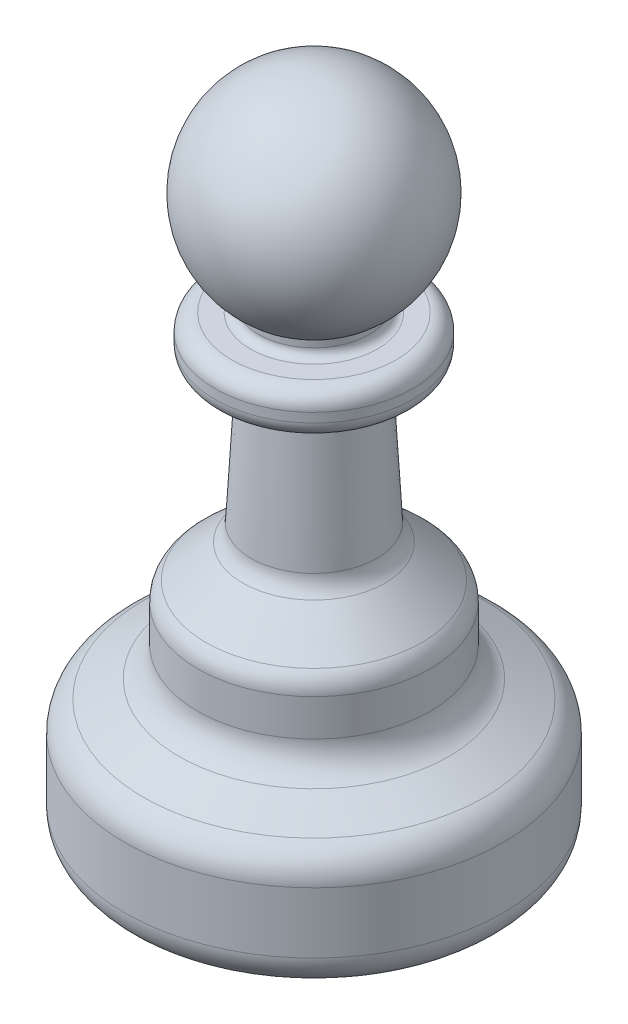
ISO-10303-21;
HEADER;
FILE_DESCRIPTION(('STEP AP214'),'2;1');
FILE_NAME('part.step','',(''),(''),'','','');
FILE_SCHEMA(('AUTOMOTIVE_DESIGN { 1 0 10303 214 1 1 1 1 }'));
ENDSEC;
DATA;
#1=APPLICATION_CONTEXT('core data for automotive mechanical design processes');
#2=APPLICATION_PROTOCOL_DEFINITION('international standard','automotive_design',2000,#1);
#3=PRODUCT_CONTEXT('',#1,'mechanical');
#4=PRODUCT('Part','Part','',(#3));
#5=PRODUCT_RELATED_PRODUCT_CATEGORY('part','',(#4));
#6=PRODUCT_DEFINITION_FORMATION('','',#4);
#7=PRODUCT_DEFINITION_CONTEXT('part definition',#1,'design');
#8=PRODUCT_DEFINITION('design','',#6,#7);
#9=PRODUCT_DEFINITION_SHAPE('','',#8);
#10=(LENGTH_UNIT() NAMED_UNIT(*) SI_UNIT(.MILLI.,.METRE.));
#11=(NAMED_UNIT(*) PLANE_ANGLE_UNIT() SI_UNIT($,.RADIAN.));
#12=(NAMED_UNIT(*) SI_UNIT($,.STERADIAN.) SOLID_ANGLE_UNIT());
#13=UNCERTAINTY_MEASURE_WITH_UNIT(LENGTH_MEASURE(1.E-05),#10,'distance_accuracy_value','');
#14=(GEOMETRIC_REPRESENTATION_CONTEXT(3) GLOBAL_UNCERTAINTY_ASSIGNED_CONTEXT((#13)) GLOBAL_UNIT_ASSIGNED_CONTEXT((#10,
#11,#12)) REPRESENTATION_CONTEXT('',''));
#15=CARTESIAN_POINT('',(0.,0.,0.));
#16=DIRECTION('',(0.,0.,1.));
#17=DIRECTION('',(1.,0.,0.));
#18=AXIS2_PLACEMENT_3D('',#15,#16,#17);
#19=CARTESIAN_POINT('',(25.4657033401047,67.5,0.));
#20=DIRECTION('',(0.,-1.,0.));
#21=DIRECTION('',(1.,0.,0.));
#22=AXIS2_PLACEMENT_3D('',#19,#20,#21);
#23=SPHERICAL_SURFACE('',#22,12.5);
#24=CARTESIAN_POINT('',(25.4657033401048,56.8990852902304,0.));
#25=DIRECTION('',(0.,-1.,0.));
#26=DIRECTION('',(1.,0.,0.));
#27=AXIS2_PLACEMENT_3D('',#24,#25,#26);
#28=CIRCLE('',#27,6.62348905911311);
#29=CARTESIAN_POINT('',(32.0891923992179,56.8990852902304,0.));
#30=VERTEX_POINT('',#29);
#31=EDGE_CURVE('E10',#30,#30,#28,.T.);
#32=ORIENTED_EDGE('',*,*,#31,.F.);
#33=EDGE_LOOP('',(#32));
#34=FACE_BOUND('',#33,.T.);
#35=ADVANCED_FACE('F35',(#34),#23,.T.);
#36=CARTESIAN_POINT('',(25.4657033401048,0.,0.));
#37=DIRECTION('',(0.,-1.,0.));
#38=DIRECTION('',(1.,0.,0.));
#39=AXIS2_PLACEMENT_3D('',#36,#37,#38);
#40=CYLINDRICAL_SURFACE('',#39,6.62348905911311);
#41=CARTESIAN_POINT('',(25.4657033401048,56.0860915544175,0.));
#42=DIRECTION('',(0.,-1.,0.));
#43=DIRECTION('',(1.,0.,0.));
#44=AXIS2_PLACEMENT_3D('',#41,#42,#43);
#45=CIRCLE('',#44,6.62348905911311);
#46=CARTESIAN_POINT('',(32.0891923992179,56.0860915544175,0.));
#47=VERTEX_POINT('',#46);
#48=EDGE_CURVE('E41',#47,#47,#45,.T.);
#49=ORIENTED_EDGE('',*,*,#48,.F.);
#50=EDGE_LOOP('',(#49));
#51=FACE_BOUND('',#50,.T.);
#52=ORIENTED_EDGE('',*,*,#31,.T.);
#53=EDGE_LOOP('',(#52));
#54=FACE_BOUND('',#53,.T.);
#55=ADVANCED_FACE('F200',(#51,#54),#40,.T.);
#56=CARTESIAN_POINT('',(25.4657033401047,56.0860915544175,0.));
#57=DIRECTION('',(0.,-1.,0.));
#58=DIRECTION('',(1.,0.,0.));
#59=AXIS2_PLACEMENT_3D('',#56,#57,#58);
#60=TOROIDAL_SURFACE('',#59,7.62348905911311,1.);
#61=CARTESIAN_POINT('',(25.4657033401048,55.0860915544175,0.));
#62=DIRECTION('',(0.,-1.,0.));
#63=DIRECTION('',(1.,0.,0.));
#64=AXIS2_PLACEMENT_3D('',#61,#62,#63);
#65=CIRCLE('',#64,7.62348905911312);
#66=CARTESIAN_POINT('',(33.0891923992179,55.0860915544175,0.));
#67=VERTEX_POINT('',#66);
#68=EDGE_CURVE('E45',#67,#67,#65,.T.);
#69=ORIENTED_EDGE('',*,*,#68,.F.);
#70=EDGE_LOOP('',(#69));
#71=FACE_BOUND('',#70,.T.);
#72=ORIENTED_EDGE('',*,*,#48,.T.);
#73=EDGE_LOOP('',(#72));
#74=FACE_BOUND('',#73,.T.);
#75=ADVANCED_FACE('F195',(#71,#74),#60,.F.);
#76=CARTESIAN_POINT('',(15.5900832441826,55.0860915544175,0.));
#77=DIRECTION('',(0.,-1.,0.));
#78=DIRECTION('',(1.,0.,0.));
#79=AXIS2_PLACEMENT_3D('',#76,#77,#78);
#80=PLANE('',#79);
#81=CARTESIAN_POINT('',(25.4657033401048,55.0860915544175,0.));
#82=DIRECTION('',(0.,-1.,0.));
#83=DIRECTION('',(1.,0.,0.));
#84=AXIS2_PLACEMENT_3D('',#81,#82,#83);
#85=CIRCLE('',#84,9.87562009592211);
#86=CARTESIAN_POINT('',(35.3413234360269,55.0860915544175,0.));
#87=VERTEX_POINT('',#86);
#88=EDGE_CURVE('E49',#87,#87,#85,.T.);
#89=ORIENTED_EDGE('',*,*,#88,.F.);
#90=EDGE_LOOP('',(#89));
#91=FACE_BOUND('',#90,.T.);
#92=ORIENTED_EDGE('',*,*,#68,.T.);
#93=EDGE_LOOP('',(#92));
#94=FACE_BOUND('',#93,.T.);
#95=ADVANCED_FACE('F189',(#91,#94),#80,.F.);
#96=CARTESIAN_POINT('',(25.4657033401047,53.0860915544175,0.));
#97=DIRECTION('',(0.,-1.,0.));
#98=DIRECTION('',(1.,0.,0.));
#99=AXIS2_PLACEMENT_3D('',#96,#97,#98);
#100=TOROIDAL_SURFACE('',#99,9.87562009592212,2.);
#101=CARTESIAN_POINT('',(25.4657033401048,53.0860915544175,0.));
#102=DIRECTION('',(0.,-1.,0.));
#103=DIRECTION('',(1.,0.,0.));
#104=AXIS2_PLACEMENT_3D('',#101,#102,#103);
#105=CIRCLE('',#104,11.8756200959221);
#106=CARTESIAN_POINT('',(37.3413234360269,53.0860915544175,0.));
#107=VERTEX_POINT('',#106);
#108=EDGE_CURVE('E54',#107,#107,#105,.T.);
#109=ORIENTED_EDGE('',*,*,#108,.F.);
#110=EDGE_LOOP('',(#109));
#111=FACE_BOUND('',#110,.T.);
#112=ORIENTED_EDGE('',*,*,#88,.T.);
#113=EDGE_LOOP('',(#112));
#114=FACE_BOUND('',#113,.T.);
#115=ADVANCED_FACE('F183',(#111,#114),#100,.T.);
#116=CARTESIAN_POINT('',(25.4657033401048,0.,0.));
#117=DIRECTION('',(0.,-1.,0.));
#118=DIRECTION('',(1.,0.,0.));
#119=AXIS2_PLACEMENT_3D('',#116,#117,#118);
#120=CYLINDRICAL_SURFACE('',#119,11.8756200959221);
#121=CARTESIAN_POINT('',(25.4657033401048,51.9724533042007,0.));
#122=DIRECTION('',(0.,-1.,0.));
#123=DIRECTION('',(1.,0.,0.));
#124=AXIS2_PLACEMENT_3D('',#121,#122,#123);
#125=CIRCLE('',#124,11.8756200959221);
#126=CARTESIAN_POINT('',(37.3413234360269,51.9724533042007,0.));
#127=VERTEX_POINT('',#126);
#128=EDGE_CURVE('E57',#127,#127,#125,.T.);
#129=ORIENTED_EDGE('',*,*,#128,.F.);
#130=EDGE_LOOP('',(#129));
#131=FACE_BOUND('',#130,.T.);
#132=ORIENTED_EDGE('',*,*,#108,.T.);
#133=EDGE_LOOP('',(#132));
#134=FACE_BOUND('',#133,.T.);
#135=ADVANCED_FACE('F177',(#131,#134),#120,.T.);
#136=CARTESIAN_POINT('',(25.4657033401047,51.9724533042007,0.));
#137=DIRECTION('',(0.,-1.,0.));
#138=DIRECTION('',(1.,0.,0.));
#139=AXIS2_PLACEMENT_3D('',#136,#137,#138);
#140=TOROIDAL_SURFACE('',#139,9.87562009592212,2.);
#141=CARTESIAN_POINT('',(25.4657033401048,49.9724533042007,0.));
#142=DIRECTION('',(0.,-1.,0.));
#143=DIRECTION('',(1.,0.,0.));
#144=AXIS2_PLACEMENT_3D('',#141,#142,#143);
#145=CIRCLE('',#144,9.87562009592211);
#146=CARTESIAN_POINT('',(35.3413234360269,49.9724533042007,0.));
#147=VERTEX_POINT('',#146);
#148=EDGE_CURVE('E60',#147,#147,#145,.T.);
#149=ORIENTED_EDGE('',*,*,#148,.F.);
#150=EDGE_LOOP('',(#149));
#151=FACE_BOUND('',#150,.T.);
#152=ORIENTED_EDGE('',*,*,#128,.T.);
#153=EDGE_LOOP('',(#152));
#154=FACE_BOUND('',#153,.T.);
#155=ADVANCED_FACE('F171',(#151,#154),#140,.T.);
#156=CARTESIAN_POINT('',(17.7860875273158,49.9724533042007,0.));
#157=DIRECTION('',(0.,1.,0.));
#158=DIRECTION('',(-1.,0.,0.));
#159=AXIS2_PLACEMENT_3D('',#156,#157,#158);
#160=PLANE('',#159);
#161=CARTESIAN_POINT('',(25.4657033401048,49.9724533042007,0.));
#162=DIRECTION('',(0.,-1.,0.));
#163=DIRECTION('',(1.,0.,0.));
#164=AXIS2_PLACEMENT_3D('',#161,#162,#163);
#165=CIRCLE('',#164,7.67961581278896);
#166=CARTESIAN_POINT('',(33.1453191528937,49.9724533042007,0.));
#167=VERTEX_POINT('',#166);
#168=EDGE_CURVE('E63',#167,#167,#165,.T.);
#169=ORIENTED_EDGE('',*,*,#168,.F.);
#170=EDGE_LOOP('',(#169));
#171=FACE_BOUND('',#170,.T.);
#172=ORIENTED_EDGE('',*,*,#148,.T.);
#173=EDGE_LOOP('',(#172));
#174=FACE_BOUND('',#173,.T.);
#175=ADVANCED_FACE('F165',(#171,#174),#160,.F.);
#176=CARTESIAN_POINT('',(25.4657033401048,48.9724533042007,0.));
#177=DIRECTION('',(0.,-1.,0.));
#178=DIRECTION('',(1.,0.,0.));
#179=AXIS2_PLACEMENT_3D('',#176,#177,#178);
#180=TOROIDAL_SURFACE('',#179,7.67961581278895,1.);
#181=CARTESIAN_POINT('',(25.4657033401048,48.9178993111506,0.));
#182=DIRECTION('',(0.,-1.,0.));
#183=DIRECTION('',(1.,0.,0.));
#184=AXIS2_PLACEMENT_3D('',#181,#182,#183);
#185=CIRCLE('',#184,6.68110499069323);
#186=CARTESIAN_POINT('',(32.146808330798,48.9178993111506,0.));
#187=VERTEX_POINT('',#186);
#188=EDGE_CURVE('E66',#187,#187,#185,.T.);
#189=ORIENTED_EDGE('',*,*,#188,.F.);
#190=EDGE_LOOP('',(#189));
#191=FACE_BOUND('',#190,.T.);
#192=ORIENTED_EDGE('',*,*,#168,.T.);
#193=EDGE_LOOP('',(#192));
#194=FACE_BOUND('',#193,.T.);
#195=ADVANCED_FACE('F159',(#191,#194),#180,.F.);
#196=CARTESIAN_POINT('',(25.4657033401048,48.9178993111506,0.));
#197=DIRECTION('',(0.,-1.,0.));
#198=DIRECTION('',(1.,0.,0.));
#199=AXIS2_PLACEMENT_3D('',#196,#197,#198);
#200=CONICAL_SURFACE('',#199,6.68110499069323,0.054581089391703);
#201=CARTESIAN_POINT('',(25.4657033401048,33.2714351922485,0.));
#202=DIRECTION('',(0.,-1.,0.));
#203=DIRECTION('',(1.,0.,0.));
#204=AXIS2_PLACEMENT_3D('',#201,#202,#203);
#205=CIRCLE('',#204,7.53595510940364);
#206=CARTESIAN_POINT('',(33.0016584495084,33.2714351922485,0.));
#207=VERTEX_POINT('',#206);
#208=EDGE_CURVE('E69',#207,#207,#205,.T.);
#209=ORIENTED_EDGE('',*,*,#208,.F.);
#210=EDGE_LOOP('',(#209));
#211=FACE_BOUND('',#210,.T.);
#212=ORIENTED_EDGE('',*,*,#188,.T.);
#213=EDGE_LOOP('',(#212));
#214=FACE_BOUND('',#213,.T.);
#215=ADVANCED_FACE('F153',(#211,#214),#200,.T.);
#216=CARTESIAN_POINT('',(25.4657033401048,33.435097171399,0.));
#217=DIRECTION('',(0.,-1.,0.));
#218=DIRECTION('',(1.,0.,0.));
#219=AXIS2_PLACEMENT_3D('',#216,#217,#218);
#220=TOROIDAL_SURFACE('',#219,10.5314875756908,3.);
#221=CARTESIAN_POINT('',(25.4657033401048,31.2012093559431,0.));
#222=DIRECTION('',(0.,-1.,0.));
#223=DIRECTION('',(1.,0.,0.));
#224=AXIS2_PLACEMENT_3D('',#221,#222,#223);
#225=CIRCLE('',#224,8.52905275079442);
#226=CARTESIAN_POINT('',(33.9947560908992,31.2012093559431,0.));
#227=VERTEX_POINT('',#226);
#228=EDGE_CURVE('E72',#227,#227,#225,.T.);
#229=ORIENTED_EDGE('',*,*,#228,.F.);
#230=EDGE_LOOP('',(#229));
#231=FACE_BOUND('',#230,.T.);
#232=ORIENTED_EDGE('',*,*,#208,.T.);
#233=EDGE_LOOP('',(#232));
#234=FACE_BOUND('',#233,.T.);
#235=ADVANCED_FACE('F147',(#231,#234),#220,.F.);
#236=CARTESIAN_POINT('',(25.4657033401048,31.2012093559431,0.));
#237=DIRECTION('',(0.,-1.,0.));
#238=DIRECTION('',(1.,0.,0.));
#239=AXIS2_PLACEMENT_3D('',#236,#237,#238);
#240=CONICAL_SURFACE('',#239,8.52905275079442,0.839979252789153);
#241=CARTESIAN_POINT('',(25.4657033401048,27.2297140311767,0.));
#242=DIRECTION('',(0.,-1.,0.));
#243=DIRECTION('',(1.,0.,0.));
#244=AXIS2_PLACEMENT_3D('',#241,#242,#243);
#245=CIRCLE('',#244,12.9595964592992);
#246=CARTESIAN_POINT('',(38.4252997994039,27.2297140311767,0.));
#247=VERTEX_POINT('',#246);
#248=EDGE_CURVE('E75',#247,#247,#245,.T.);
#249=ORIENTED_EDGE('',*,*,#248,.F.);
#250=EDGE_LOOP('',(#249));
#251=FACE_BOUND('',#250,.T.);
#252=ORIENTED_EDGE('',*,*,#228,.T.);
#253=EDGE_LOOP('',(#252));
#254=FACE_BOUND('',#253,.T.);
#255=ADVANCED_FACE('F141',(#251,#254),#240,.T.);
#256=CARTESIAN_POINT('',(25.4657033401048,24.9958262157208,0.));
#257=DIRECTION('',(0.,-1.,0.));
#258=DIRECTION('',(1.,0.,0.));
#259=AXIS2_PLACEMENT_3D('',#256,#257,#258);
#260=TOROIDAL_SURFACE('',#259,10.9571616344028,3.);
#261=CARTESIAN_POINT('',(25.4657033401048,24.9958262157208,0.));
#262=DIRECTION('',(0.,-1.,0.));
#263=DIRECTION('',(1.,0.,0.));
#264=AXIS2_PLACEMENT_3D('',#261,#262,#263);
#265=CIRCLE('',#264,13.9571616344028);
#266=CARTESIAN_POINT('',(39.4228649745075,24.9958262157208,0.));
#267=VERTEX_POINT('',#266);
#268=EDGE_CURVE('E78',#267,#267,#265,.T.);
#269=ORIENTED_EDGE('',*,*,#268,.F.);
#270=EDGE_LOOP('',(#269));
#271=FACE_BOUND('',#270,.T.);
#272=ORIENTED_EDGE('',*,*,#248,.T.);
#273=EDGE_LOOP('',(#272));
#274=FACE_BOUND('',#273,.T.);
#275=ADVANCED_FACE('F135',(#271,#274),#260,.T.);
#276=CARTESIAN_POINT('',(25.4657033401048,0.,0.));
#277=DIRECTION('',(0.,-1.,0.));
#278=DIRECTION('',(1.,0.,0.));
#279=AXIS2_PLACEMENT_3D('',#276,#277,#278);
#280=CYLINDRICAL_SURFACE('',#279,13.9571616344028);
#281=CARTESIAN_POINT('',(25.4657033401048,20.5901738589156,0.));
#282=DIRECTION('',(0.,-1.,0.));
#283=DIRECTION('',(1.,0.,0.));
#284=AXIS2_PLACEMENT_3D('',#281,#282,#283);
#285=CIRCLE('',#284,13.9571616344028);
#286=CARTESIAN_POINT('',(39.4228649745075,20.5901738589156,0.));
#287=VERTEX_POINT('',#286);
#288=EDGE_CURVE('E81',#287,#287,#285,.T.);
#289=ORIENTED_EDGE('',*,*,#288,.F.);
#290=EDGE_LOOP('',(#289));
#291=FACE_BOUND('',#290,.T.);
#292=ORIENTED_EDGE('',*,*,#268,.T.);
#293=EDGE_LOOP('',(#292));
#294=FACE_BOUND('',#293,.T.);
#295=ADVANCED_FACE('F129',(#291,#294),#280,.T.);
#296=CARTESIAN_POINT('',(25.4657033401048,20.5901738589156,0.));
#297=DIRECTION('',(0.,-1.,0.));
#298=DIRECTION('',(1.,0.,0.));
#299=AXIS2_PLACEMENT_3D('',#296,#297,#298);
#300=TOROIDAL_SURFACE('',#299,17.9571616344028,4.);
#301=CARTESIAN_POINT('',(25.4657033401048,17.0005798160862,0.));
#302=DIRECTION('',(0.,-1.,0.));
#303=DIRECTION('',(1.,0.,0.));
#304=AXIS2_PLACEMENT_3D('',#301,#302,#303);
#305=CIRCLE('',#304,16.1922778966784);
#306=CARTESIAN_POINT('',(41.6579812367831,17.0005798160862,0.));
#307=VERTEX_POINT('',#306);
#308=EDGE_CURVE('E84',#307,#307,#305,.T.);
#309=ORIENTED_EDGE('',*,*,#308,.F.);
#310=EDGE_LOOP('',(#309));
#311=FACE_BOUND('',#310,.T.);
#312=ORIENTED_EDGE('',*,*,#288,.T.);
#313=EDGE_LOOP('',(#312));
#314=FACE_BOUND('',#313,.T.);
#315=ADVANCED_FACE('F123',(#311,#314),#300,.F.);
#316=CARTESIAN_POINT('',(25.4657033401048,17.0005798160862,0.));
#317=DIRECTION('',(0.,-1.,0.));
#318=DIRECTION('',(1.,0.,0.));
#319=AXIS2_PLACEMENT_3D('',#316,#317,#318);
#320=CONICAL_SURFACE('',#319,16.1922778966784,1.11383758124776);
#321=CARTESIAN_POINT('',(25.4657033401048,14.8982345972554,0.));
#322=DIRECTION('',(0.,-1.,0.));
#323=DIRECTION('',(1.,0.,0.));
#324=AXIS2_PLACEMENT_3D('',#321,#322,#323);
#325=CIRCLE('',#324,20.4682342739615);
#326=CARTESIAN_POINT('',(45.9339376140662,14.8982345972554,0.));
#327=VERTEX_POINT('',#326);
#328=EDGE_CURVE('E87',#327,#327,#325,.T.);
#329=ORIENTED_EDGE('',*,*,#328,.F.);
#330=EDGE_LOOP('',(#329));
#331=FACE_BOUND('',#330,.T.);
#332=ORIENTED_EDGE('',*,*,#308,.T.);
#333=EDGE_LOOP('',(#332));
#334=FACE_BOUND('',#333,.T.);
#335=ADVANCED_FACE('F117',(#331,#334),#320,.T.);
#336=CARTESIAN_POINT('',(25.4657033401048,11.308640554426,0.));
#337=DIRECTION('',(0.,-1.,0.));
#338=DIRECTION('',(1.,0.,0.));
#339=AXIS2_PLACEMENT_3D('',#336,#337,#338);
#340=TOROIDAL_SURFACE('',#339,18.7033505362371,4.);
#341=CARTESIAN_POINT('',(25.4657033401048,11.308640554426,0.));
#342=DIRECTION('',(0.,-1.,0.));
#343=DIRECTION('',(1.,0.,0.));
#344=AXIS2_PLACEMENT_3D('',#341,#342,#343);
#345=CIRCLE('',#344,22.7033505362371);
#346=CARTESIAN_POINT('',(48.1690538763418,11.308640554426,0.));
#347=VERTEX_POINT('',#346);
#348=EDGE_CURVE('E90',#347,#347,#345,.T.);
#349=ORIENTED_EDGE('',*,*,#348,.F.);
#350=EDGE_LOOP('',(#349));
#351=FACE_BOUND('',#350,.T.);
#352=ORIENTED_EDGE('',*,*,#328,.T.);
#353=EDGE_LOOP('',(#352));
#354=FACE_BOUND('',#353,.T.);
#355=ADVANCED_FACE('F111',(#351,#354),#340,.T.);
#356=CARTESIAN_POINT('',(25.4657033401048,0.,0.));
#357=DIRECTION('',(0.,-1.,0.));
#358=DIRECTION('',(1.,0.,0.));
#359=AXIS2_PLACEMENT_3D('',#356,#357,#358);
#360=CYLINDRICAL_SURFACE('',#359,22.7033505362371);
#361=CARTESIAN_POINT('',(25.4657033401048,4.,0.));
#362=DIRECTION('',(0.,-1.,0.));
#363=DIRECTION('',(1.,0.,0.));
#364=AXIS2_PLACEMENT_3D('',#361,#362,#363);
#365=CIRCLE('',#364,22.7033505362371);
#366=CARTESIAN_POINT('',(48.1690538763418,4.,0.));
#367=VERTEX_POINT('',#366);
#368=EDGE_CURVE('E93',#367,#367,#365,.T.);
#369=ORIENTED_EDGE('',*,*,#368,.F.);
#370=EDGE_LOOP('',(#369));
#371=FACE_BOUND('',#370,.T.);
#372=ORIENTED_EDGE('',*,*,#348,.T.);
#373=EDGE_LOOP('',(#372));
#374=FACE_BOUND('',#373,.T.);
#375=ADVANCED_FACE('F105',(#371,#374),#360,.T.);
#376=CARTESIAN_POINT('',(25.4657033401048,4.,0.));
#377=DIRECTION('',(0.,-1.,0.));
#378=DIRECTION('',(1.,0.,0.));
#379=AXIS2_PLACEMENT_3D('',#376,#377,#378);
#380=TOROIDAL_SURFACE('',#379,18.7033505362371,4.);
#381=CARTESIAN_POINT('',(25.4657033401048,0.,0.));
#382=DIRECTION('',(0.,-1.,0.));
#383=DIRECTION('',(1.,0.,0.));
#384=AXIS2_PLACEMENT_3D('',#381,#382,#383);
#385=CIRCLE('',#384,18.703350536237);
#386=CARTESIAN_POINT('',(44.1690538763418,0.,0.));
#387=VERTEX_POINT('',#386);
#388=EDGE_CURVE('E96',#387,#387,#385,.T.);
#389=ORIENTED_EDGE('',*,*,#388,.F.);
#390=EDGE_LOOP('',(#389));
#391=FACE_BOUND('',#390,.T.);
#392=ORIENTED_EDGE('',*,*,#368,.T.);
#393=EDGE_LOOP('',(#392));
#394=FACE_BOUND('',#393,.T.);
#395=ADVANCED_FACE('F102',(#391,#394),#380,.T.);
#396=CARTESIAN_POINT('',(6.76235280386773,0.,0.));
#397=DIRECTION('',(0.,1.,0.));
#398=DIRECTION('',(-1.,0.,0.));
#399=AXIS2_PLACEMENT_3D('',#396,#397,#398);
#400=PLANE('',#399);
#401=ORIENTED_EDGE('',*,*,#388,.T.);
#402=EDGE_LOOP('',(#401));
#403=FACE_BOUND('',#402,.T.);
#404=ADVANCED_FACE('F100',(#403),#400,.F.);
#405=CLOSED_SHELL('',(#35,#55,#75,#95,#115,#135,#155,#175,#195,#215,#235,#255,#275,#295,#315,
#335,#355,#375,#395,#404));
#406=MANIFOLD_SOLID_BREP('B2',#405);
#407=ADVANCED_BREP_SHAPE_REPRESENTATION('',(#18,#406),#14);
#408=SHAPE_DEFINITION_REPRESENTATION(#9,#407);
ENDSEC;
END-ISO-10303-21;
